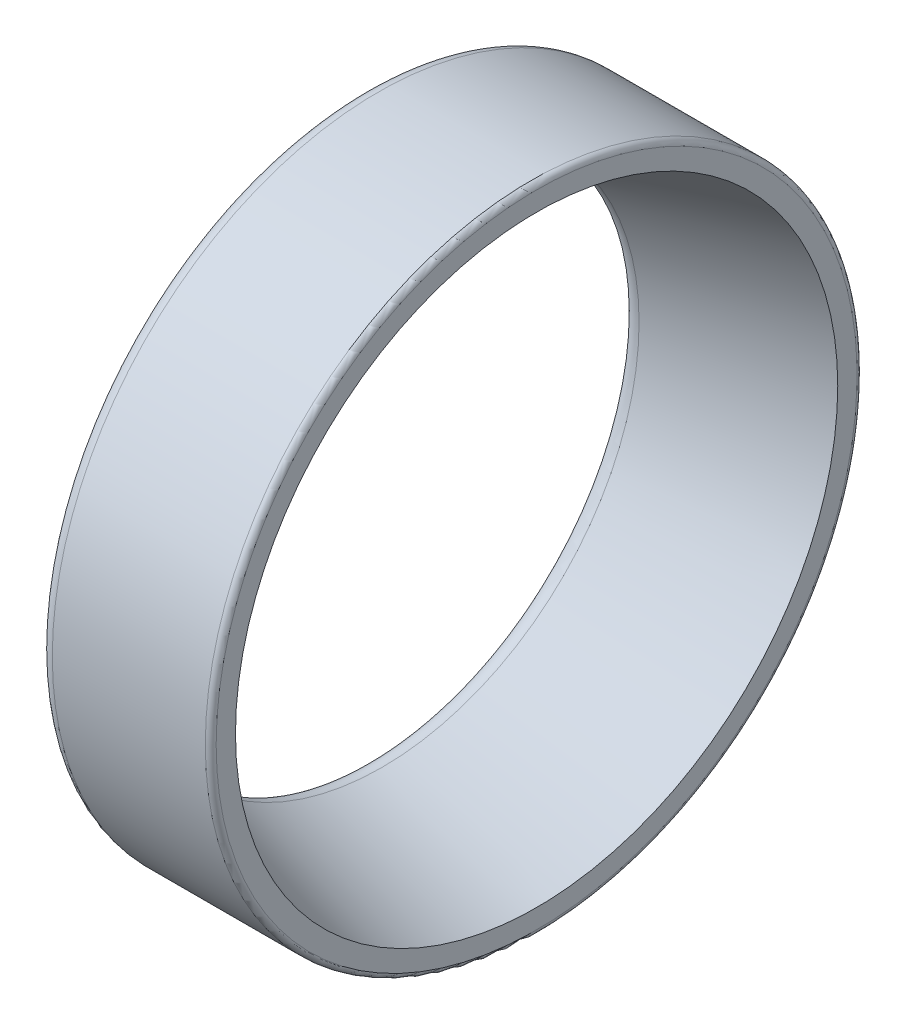
ISO-10303-21;
HEADER;
FILE_DESCRIPTION(('STEP AP214'),'2;1');
FILE_NAME('part.step','',(''),(''),'','','');
FILE_SCHEMA(('AUTOMOTIVE_DESIGN { 1 0 10303 214 1 1 1 1 }'));
ENDSEC;
DATA;
#1=APPLICATION_CONTEXT('core data for automotive mechanical design processes');
#2=APPLICATION_PROTOCOL_DEFINITION('international standard','automotive_design',2000,#1);
#3=PRODUCT_CONTEXT('',#1,'mechanical');
#4=PRODUCT('Part','Part','',(#3));
#5=PRODUCT_RELATED_PRODUCT_CATEGORY('part','',(#4));
#6=PRODUCT_DEFINITION_FORMATION('','',#4);
#7=PRODUCT_DEFINITION_CONTEXT('part definition',#1,'design');
#8=PRODUCT_DEFINITION('design','',#6,#7);
#9=PRODUCT_DEFINITION_SHAPE('','',#8);
#10=(LENGTH_UNIT() NAMED_UNIT(*) SI_UNIT(.MILLI.,.METRE.));
#11=(NAMED_UNIT(*) PLANE_ANGLE_UNIT() SI_UNIT($,.RADIAN.));
#12=(NAMED_UNIT(*) SI_UNIT($,.STERADIAN.) SOLID_ANGLE_UNIT());
#13=UNCERTAINTY_MEASURE_WITH_UNIT(LENGTH_MEASURE(1.E-05),#10,'distance_accuracy_value','');
#14=(GEOMETRIC_REPRESENTATION_CONTEXT(3) GLOBAL_UNCERTAINTY_ASSIGNED_CONTEXT((#13)) GLOBAL_UNIT_ASSIGNED_CONTEXT((#10,
#11,#12)) REPRESENTATION_CONTEXT('',''));
#15=CARTESIAN_POINT('',(0.,0.,0.));
#16=DIRECTION('',(0.,0.,1.));
#17=DIRECTION('',(1.,0.,0.));
#18=AXIS2_PLACEMENT_3D('',#15,#16,#17);
#19=CARTESIAN_POINT('',(0.6,0.,0.));
#20=DIRECTION('',(-1.,0.,0.));
#21=DIRECTION('',(0.,0.,1.));
#22=AXIS2_PLACEMENT_3D('',#19,#20,#21);
#23=TOROIDAL_SURFACE('',#22,29.8541479837664,1.5);
#24=CARTESIAN_POINT('',(1.00983971266646,0.,0.));
#25=DIRECTION('',(-1.,0.,0.));
#26=DIRECTION('',(0.,0.,1.));
#27=AXIS2_PLACEMENT_3D('',#24,#25,#26);
#28=CIRCLE('',#27,28.4112233807737);
#29=CARTESIAN_POINT('',(1.00983971266646,0.,28.4112233807737));
#30=VERTEX_POINT('',#29);
#31=EDGE_CURVE('E10',#30,#30,#28,.T.);
#32=ORIENTED_EDGE('',*,*,#31,.F.);
#33=EDGE_LOOP('',(#32));
#34=FACE_BOUND('',#33,.T.);
#35=CARTESIAN_POINT('',(-0.9,0.,0.));
#36=DIRECTION('',(-1.,0.,0.));
#37=DIRECTION('',(0.,0.,1.));
#38=AXIS2_PLACEMENT_3D('',#35,#36,#37);
#39=CIRCLE('',#38,29.8541479837664);
#40=CARTESIAN_POINT('',(-0.9,0.,29.8541479837664));
#41=VERTEX_POINT('',#40);
#42=EDGE_CURVE('E40',#41,#41,#39,.T.);
#43=ORIENTED_EDGE('',*,*,#42,.T.);
#44=EDGE_LOOP('',(#43));
#45=FACE_BOUND('',#44,.T.);
#46=ADVANCED_FACE('F15',(#34,#45),#23,.T.);
#47=CARTESIAN_POINT('',(1.00983971266646,0.,0.));
#48=DIRECTION('',(1.,0.,0.));
#49=DIRECTION('',(0.,0.,-1.));
#50=AXIS2_PLACEMENT_3D('',#47,#48,#49);
#51=CONICAL_SURFACE('',#50,28.4112233807737,0.276745541058187);
#52=CARTESIAN_POINT('',(18.1,0.,0.));
#53=DIRECTION('',(-1.,0.,0.));
#54=DIRECTION('',(0.,0.,1.));
#55=AXIS2_PLACEMENT_3D('',#52,#53,#54);
#56=CIRCLE('',#55,33.2654107493013);
#57=CARTESIAN_POINT('',(18.1,0.,33.2654107493013));
#58=VERTEX_POINT('',#57);
#59=EDGE_CURVE('E21',#58,#58,#56,.T.);
#60=ORIENTED_EDGE('',*,*,#59,.F.);
#61=EDGE_LOOP('',(#60));
#62=FACE_BOUND('',#61,.T.);
#63=ORIENTED_EDGE('',*,*,#31,.T.);
#64=EDGE_LOOP('',(#63));
#65=FACE_BOUND('',#64,.T.);
#66=ADVANCED_FACE('F71',(#62,#65),#51,.F.);
#67=CARTESIAN_POINT('',(18.1,33.2654107493013,0.));
#68=DIRECTION('',(-1.,0.,0.));
#69=DIRECTION('',(0.,0.,1.));
#70=AXIS2_PLACEMENT_3D('',#67,#68,#69);
#71=PLANE('',#70);
#72=CARTESIAN_POINT('',(18.1,0.,0.));
#73=DIRECTION('',(-1.,0.,0.));
#74=DIRECTION('',(0.,0.,1.));
#75=AXIS2_PLACEMENT_3D('',#72,#73,#74);
#76=CIRCLE('',#75,35.4);
#77=CARTESIAN_POINT('',(18.1,0.,35.4));
#78=VERTEX_POINT('',#77);
#79=EDGE_CURVE('E25',#78,#78,#76,.T.);
#80=ORIENTED_EDGE('',*,*,#79,.F.);
#81=EDGE_LOOP('',(#80));
#82=FACE_BOUND('',#81,.T.);
#83=ORIENTED_EDGE('',*,*,#59,.T.);
#84=EDGE_LOOP('',(#83));
#85=FACE_BOUND('',#84,.T.);
#86=ADVANCED_FACE('F66',(#82,#85),#71,.F.);
#87=CARTESIAN_POINT('',(17.5,0.,0.));
#88=DIRECTION('',(-1.,0.,0.));
#89=DIRECTION('',(0.,0.,1.));
#90=AXIS2_PLACEMENT_3D('',#87,#88,#89);
#91=TOROIDAL_SURFACE('',#90,35.4,0.6);
#92=CARTESIAN_POINT('',(17.5,0.,0.));
#93=DIRECTION('',(-1.,0.,0.));
#94=DIRECTION('',(0.,0.,1.));
#95=AXIS2_PLACEMENT_3D('',#92,#93,#94);
#96=CIRCLE('',#95,36.);
#97=CARTESIAN_POINT('',(17.5,0.,36.));
#98=VERTEX_POINT('',#97);
#99=EDGE_CURVE('E29',#98,#98,#96,.T.);
#100=ORIENTED_EDGE('',*,*,#99,.F.);
#101=EDGE_LOOP('',(#100));
#102=FACE_BOUND('',#101,.T.);
#103=ORIENTED_EDGE('',*,*,#79,.T.);
#104=EDGE_LOOP('',(#103));
#105=FACE_BOUND('',#104,.T.);
#106=ADVANCED_FACE('F60',(#102,#105),#91,.T.);
#107=CARTESIAN_POINT('',(0.,0.,0.));
#108=DIRECTION('',(-1.,0.,0.));
#109=DIRECTION('',(0.,0.,1.));
#110=AXIS2_PLACEMENT_3D('',#107,#108,#109);
#111=CYLINDRICAL_SURFACE('',#110,36.);
#112=CARTESIAN_POINT('',(0.6,0.,0.));
#113=DIRECTION('',(-1.,0.,0.));
#114=DIRECTION('',(0.,0.,1.));
#115=AXIS2_PLACEMENT_3D('',#112,#113,#114);
#116=CIRCLE('',#115,36.);
#117=CARTESIAN_POINT('',(0.6,0.,36.));
#118=VERTEX_POINT('',#117);
#119=EDGE_CURVE('E34',#118,#118,#116,.T.);
#120=ORIENTED_EDGE('',*,*,#119,.F.);
#121=EDGE_LOOP('',(#120));
#122=FACE_BOUND('',#121,.T.);
#123=ORIENTED_EDGE('',*,*,#99,.T.);
#124=EDGE_LOOP('',(#123));
#125=FACE_BOUND('',#124,.T.);
#126=ADVANCED_FACE('F54',(#122,#125),#111,.T.);
#127=CARTESIAN_POINT('',(0.6,0.,0.));
#128=DIRECTION('',(-1.,0.,0.));
#129=DIRECTION('',(0.,0.,1.));
#130=AXIS2_PLACEMENT_3D('',#127,#128,#129);
#131=TOROIDAL_SURFACE('',#130,34.5,1.5);
#132=CARTESIAN_POINT('',(-0.9,0.,0.));
#133=DIRECTION('',(-1.,0.,0.));
#134=DIRECTION('',(0.,0.,1.));
#135=AXIS2_PLACEMENT_3D('',#132,#133,#134);
#136=CIRCLE('',#135,34.5);
#137=CARTESIAN_POINT('',(-0.9,0.,34.5));
#138=VERTEX_POINT('',#137);
#139=EDGE_CURVE('E37',#138,#138,#136,.T.);
#140=ORIENTED_EDGE('',*,*,#139,.F.);
#141=EDGE_LOOP('',(#140));
#142=FACE_BOUND('',#141,.T.);
#143=ORIENTED_EDGE('',*,*,#119,.T.);
#144=EDGE_LOOP('',(#143));
#145=FACE_BOUND('',#144,.T.);
#146=ADVANCED_FACE('F48',(#142,#145),#131,.T.);
#147=CARTESIAN_POINT('',(-0.9,34.5,0.));
#148=DIRECTION('',(1.,0.,0.));
#149=DIRECTION('',(0.,0.,-1.));
#150=AXIS2_PLACEMENT_3D('',#147,#148,#149);
#151=PLANE('',#150);
#152=ORIENTED_EDGE('',*,*,#42,.F.);
#153=EDGE_LOOP('',(#152));
#154=FACE_BOUND('',#153,.T.);
#155=ORIENTED_EDGE('',*,*,#139,.T.);
#156=EDGE_LOOP('',(#155));
#157=FACE_BOUND('',#156,.T.);
#158=ADVANCED_FACE('F45',(#154,#157),#151,.F.);
#159=CLOSED_SHELL('',(#46,#66,#86,#106,#126,#146,#158));
#160=MANIFOLD_SOLID_BREP('B1',#159);
#161=ADVANCED_BREP_SHAPE_REPRESENTATION('',(#18,#160),#14);
#162=SHAPE_DEFINITION_REPRESENTATION(#9,#161);
ENDSEC;
END-ISO-10303-21;
